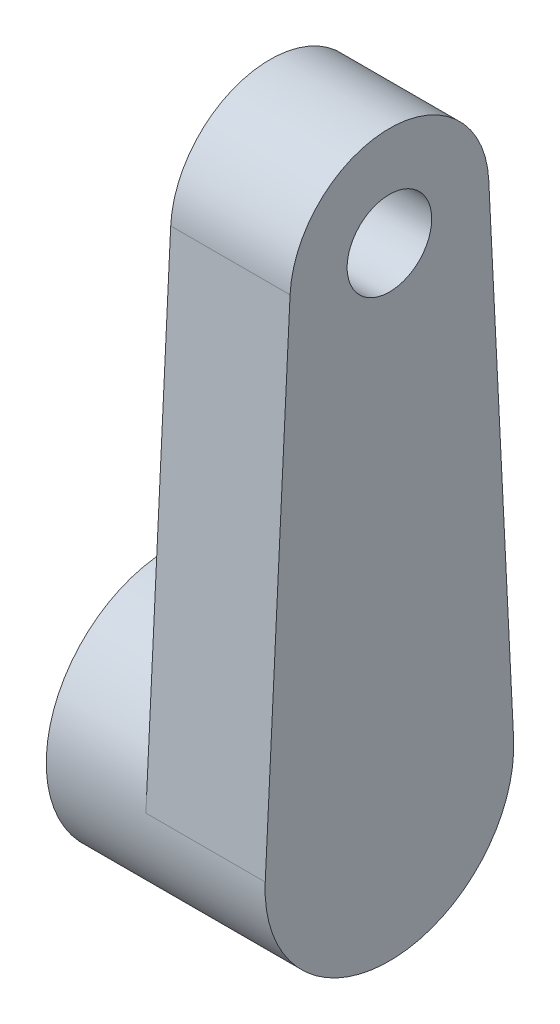
ISO-10303-21;
HEADER;
FILE_DESCRIPTION(('STEP AP214'),'2;1');
FILE_NAME('part.step','',(''),(''),'','','');
FILE_SCHEMA(('AUTOMOTIVE_DESIGN { 1 0 10303 214 1 1 1 1 }'));
ENDSEC;
DATA;
#1=APPLICATION_CONTEXT('core data for automotive mechanical design processes');
#2=APPLICATION_PROTOCOL_DEFINITION('international standard','automotive_design',2000,#1);
#3=PRODUCT_CONTEXT('',#1,'mechanical');
#4=PRODUCT('Part','Part','',(#3));
#5=PRODUCT_RELATED_PRODUCT_CATEGORY('part','',(#4));
#6=PRODUCT_DEFINITION_FORMATION('','',#4);
#7=PRODUCT_DEFINITION_CONTEXT('part definition',#1,'design');
#8=PRODUCT_DEFINITION('design','',#6,#7);
#9=PRODUCT_DEFINITION_SHAPE('','',#8);
#10=(LENGTH_UNIT() NAMED_UNIT(*) SI_UNIT(.MILLI.,.METRE.));
#11=(NAMED_UNIT(*) PLANE_ANGLE_UNIT() SI_UNIT($,.RADIAN.));
#12=(NAMED_UNIT(*) SI_UNIT($,.STERADIAN.) SOLID_ANGLE_UNIT());
#13=UNCERTAINTY_MEASURE_WITH_UNIT(LENGTH_MEASURE(1.E-05),#10,'distance_accuracy_value','');
#14=(GEOMETRIC_REPRESENTATION_CONTEXT(3) GLOBAL_UNCERTAINTY_ASSIGNED_CONTEXT((#13)) GLOBAL_UNIT_ASSIGNED_CONTEXT((#10,
#11,#12)) REPRESENTATION_CONTEXT('',''));
#15=CARTESIAN_POINT('',(0.,0.,0.));
#16=DIRECTION('',(0.,0.,1.));
#17=DIRECTION('',(1.,0.,0.));
#18=AXIS2_PLACEMENT_3D('',#15,#16,#17);
#19=CARTESIAN_POINT('',(10.,-2.5,1.6583123951777));
#20=DIRECTION('',(0.,1.,0.));
#21=DIRECTION('',(0.,0.,1.));
#22=AXIS2_PLACEMENT_3D('',#19,#20,#21);
#23=PLANE('',#22);
#24=CARTESIAN_POINT('',(5.,-2.5,0.));
#25=DIRECTION('',(0.,1.,0.));
#26=DIRECTION('',(0.,0.,1.));
#27=AXIS2_PLACEMENT_3D('',#24,#25,#26);
#28=CIRCLE('',#27,2.25);
#29=CARTESIAN_POINT('',(6.52069063257456,-2.5,1.6583123951777));
#30=VERTEX_POINT('',#29);
#31=CARTESIAN_POINT('',(6.52069063257456,-2.5,-1.6583123951777));
#32=VERTEX_POINT('',#31);
#33=EDGE_CURVE('E11',#30,#32,#28,.T.);
#34=ORIENTED_EDGE('',*,*,#33,.F.);
#35=DIRECTION('',(-1.,0.,0.));
#36=VECTOR('',#35,1.);
#37=CARTESIAN_POINT('',(10.,-2.5,1.6583123951777));
#38=LINE('',#37,#36);
#39=CARTESIAN_POINT('',(10.,-2.5,1.6583123951777));
#40=VERTEX_POINT('',#39);
#41=EDGE_CURVE('E117',#40,#30,#38,.T.);
#42=ORIENTED_EDGE('',*,*,#41,.F.);
#43=DIRECTION('',(0.,0.,-1.));
#44=VECTOR('',#43,1.);
#45=CARTESIAN_POINT('',(10.,-2.5,1.6583123951777));
#46=LINE('',#45,#44);
#47=CARTESIAN_POINT('',(10.,-2.5,-1.6583123951777));
#48=VERTEX_POINT('',#47);
#49=EDGE_CURVE('E147',#40,#48,#46,.T.);
#50=ORIENTED_EDGE('',*,*,#49,.T.);
#51=DIRECTION('',(-1.,0.,0.));
#52=VECTOR('',#51,1.);
#53=CARTESIAN_POINT('',(10.,-2.5,-1.6583123951777));
#54=LINE('',#53,#52);
#55=EDGE_CURVE('E124',#48,#32,#54,.T.);
#56=ORIENTED_EDGE('',*,*,#55,.T.);
#57=EDGE_LOOP('',(#34,#42,#50,#56));
#58=FACE_BOUND('',#57,.T.);
#59=ADVANCED_FACE('F39',(#58),#23,.T.);
#60=CARTESIAN_POINT('',(0.,0.,0.));
#61=DIRECTION('',(1.,0.,0.));
#62=DIRECTION('',(0.,0.,-1.));
#63=AXIS2_PLACEMENT_3D('',#60,#61,#62);
#64=PLANE('',#63);
#65=CARTESIAN_POINT('',(0.,0.,0.));
#66=DIRECTION('',(1.,0.,0.));
#67=DIRECTION('',(0.,0.,-1.));
#68=AXIS2_PLACEMENT_3D('',#65,#66,#67);
#69=CIRCLE('',#68,12.5);
#70=CARTESIAN_POINT('',(0.,0.,-12.5));
#71=VERTEX_POINT('',#70);
#72=EDGE_CURVE('E126',#71,#71,#69,.T.);
#73=ORIENTED_EDGE('',*,*,#72,.F.);
#74=EDGE_LOOP('',(#73));
#75=FACE_BOUND('',#74,.T.);
#76=CARTESIAN_POINT('',(0.,0.,0.));
#77=DIRECTION('',(1.,0.,0.));
#78=DIRECTION('',(0.,0.,-1.));
#79=AXIS2_PLACEMENT_3D('',#76,#77,#78);
#80=CIRCLE('',#79,3.);
#81=CARTESIAN_POINT('',(0.,-2.5,-1.6583123951777));
#82=VERTEX_POINT('',#81);
#83=CARTESIAN_POINT('',(0.,-2.5,1.6583123951777));
#84=VERTEX_POINT('',#83);
#85=EDGE_CURVE('E139',#82,#84,#80,.T.);
#86=ORIENTED_EDGE('',*,*,#85,.T.);
#87=DIRECTION('',(0.,0.,-1.));
#88=VECTOR('',#87,1.);
#89=CARTESIAN_POINT('',(0.,-2.5,1.6583123951777));
#90=LINE('',#89,#88);
#91=EDGE_CURVE('E122',#84,#82,#90,.T.);
#92=ORIENTED_EDGE('',*,*,#91,.T.);
#93=EDGE_LOOP('',(#86,#92));
#94=FACE_BOUND('',#93,.T.);
#95=ADVANCED_FACE('F136',(#75,#94),#64,.F.);
#96=CARTESIAN_POINT('',(10.,0.,0.));
#97=DIRECTION('',(-1.,0.,0.));
#98=DIRECTION('',(0.,0.,1.));
#99=AXIS2_PLACEMENT_3D('',#96,#97,#98);
#100=CYLINDRICAL_SURFACE('',#99,12.5);
#101=CARTESIAN_POINT('',(2.75,-12.5,0.));
#102=CARTESIAN_POINT('',(2.75000488102638,-12.4999977674912,0.1252986819868));
#103=CARTESIAN_POINT('',(2.76050187231078,-12.4980965123329,0.250661938458594));
#104=CARTESIAN_POINT('',(2.80218903515507,-12.4906952154093,0.497861978665406));
#105=CARTESIAN_POINT('',(2.83339725500035,-12.4851920348931,0.619695589851931));
#106=CARTESIAN_POINT('',(2.91552541844857,-12.4712031058359,0.856224998081114));
#107=CARTESIAN_POINT('',(2.96642818212382,-12.4627199573701,0.97092691529625));
#108=CARTESIAN_POINT('',(3.08645309823584,-12.4436998211695,1.19015008759339));
#109=CARTESIAN_POINT('',(3.15557355048877,-12.4331630251171,1.29467229146123));
#110=CARTESIAN_POINT('',(3.31088515623745,-12.4110699839934,1.49173892052012));
#111=CARTESIAN_POINT('',(3.39723883854912,-12.3995046634254,1.58415425002097));
#112=CARTESIAN_POINT('',(3.5842159193064,-12.3767261918013,1.75326760244449));
#113=CARTESIAN_POINT('',(3.6848402939975,-12.3655130649026,1.82996454920806));
#114=CARTESIAN_POINT('',(3.89840531008349,-12.3446205144066,1.96599369496265));
#115=CARTESIAN_POINT('',(4.0114299788695,-12.3349528032239,2.0251959281109));
#116=CARTESIAN_POINT('',(4.24602363137523,-12.3183728941507,2.12372345891961));
#117=CARTESIAN_POINT('',(4.36759193755188,-12.3114604780441,2.16305033075061));
#118=CARTESIAN_POINT('',(4.61444530740335,-12.3012648124572,2.22029926603351));
#119=CARTESIAN_POINT('',(4.73967674798533,-12.2979435578795,2.23844564821782));
#120=CARTESIAN_POINT('',(4.99144749766331,-12.2951915456139,2.25351448396809));
#121=CARTESIAN_POINT('',(5.11798669789394,-12.2957604666492,2.2504386902034));
#122=CARTESIAN_POINT('',(5.36716478544909,-12.3006898852657,2.22333268298987));
#123=CARTESIAN_POINT('',(5.48983233665805,-12.3050044364384,2.19955638565592));
#124=CARTESIAN_POINT('',(5.72940843527644,-12.316866899555,2.13212365102787));
#125=CARTESIAN_POINT('',(5.84631675524478,-12.3244149390804,2.08846642930116));
#126=CARTESIAN_POINT('',(6.07180514312158,-12.3419425352291,1.9822594118006));
#127=CARTESIAN_POINT('',(6.18033533525481,-12.3519353671767,1.91960600582322));
#128=CARTESIAN_POINT('',(6.38543800314245,-12.3732176723876,1.77725850028802));
#129=CARTESIAN_POINT('',(6.48200935628325,-12.3845072671906,1.69756280282899));
#130=CARTESIAN_POINT('',(6.66192113689688,-12.4073118839222,1.52201857930321));
#131=CARTESIAN_POINT('',(6.74504943632727,-12.4188278010628,1.42595261440165));
#132=CARTESIAN_POINT('',(6.89404090334848,-12.4406367648775,1.22112530278979));
#133=CARTESIAN_POINT('',(6.95990392259604,-12.4509298010443,1.11236384701145));
#134=CARTESIAN_POINT('',(7.07252198562909,-12.4691516328429,0.885019768870841));
#135=CARTESIAN_POINT('',(7.1192562084547,-12.4770778497592,0.766426612967721));
#136=CARTESIAN_POINT('',(7.19208219301229,-12.4896527895691,0.522899253039732));
#137=CARTESIAN_POINT('',(7.21817597312886,-12.4943018329256,0.397965670303355));
#138=CARTESIAN_POINT('',(7.24868797990313,-12.4997549324063,0.14713010849435));
#139=CARTESIAN_POINT('',(7.25339706021023,-12.5006105787524,0.0212645934313453));
#140=CARTESIAN_POINT('',(7.24178440397202,-12.4985225341363,-0.22945586170452));
#141=CARTESIAN_POINT('',(7.22546361660073,-12.4955790146477,-0.354310847131263));
#142=CARTESIAN_POINT('',(7.1724963833318,-12.4862554255897,-0.598552524626933));
#143=CARTESIAN_POINT('',(7.13599592657885,-12.4799000484474,-0.717971900974116));
#144=CARTESIAN_POINT('',(7.04386257152955,-12.4644623821362,-0.94899628592325));
#145=CARTESIAN_POINT('',(6.98822845527442,-12.4553799193784,-1.06060079652314));
#146=CARTESIAN_POINT('',(6.85875495092402,-12.4353669796939,-1.27407696942466));
#147=CARTESIAN_POINT('',(6.78473635943589,-12.4244186663665,-1.37583823911224));
#148=CARTESIAN_POINT('',(6.62083899882707,-12.4019371582136,-1.56559958610652));
#149=CARTESIAN_POINT('',(6.53095887246642,-12.3904039133971,-1.65359848457812));
#150=CARTESIAN_POINT('',(6.33657750091316,-12.3678828600073,-1.81443228613754));
#151=CARTESIAN_POINT('',(6.23191148877673,-12.3569034068723,-1.88706941512665));
#152=CARTESIAN_POINT('',(6.0116923490729,-12.3368965881738,-2.01373073598652));
#153=CARTESIAN_POINT('',(5.89613960574521,-12.327869153752,-2.0677555844518));
#154=CARTESIAN_POINT('',(5.65794816388005,-12.3128530018575,-2.15537258854331));
#155=CARTESIAN_POINT('',(5.53534479225576,-12.3068503934841,-2.1890582916757));
#156=CARTESIAN_POINT('',(5.28610132098664,-12.2985305984642,-2.235331641839));
#157=CARTESIAN_POINT('',(5.15946163861275,-12.2962130321129,-2.24792146258465));
#158=CARTESIAN_POINT('',(4.90771902629066,-12.2955439189313,-2.251577412795));
#159=CARTESIAN_POINT('',(4.78262066834532,-12.2971349368514,-2.24295524222454));
#160=CARTESIAN_POINT('',(4.53568688920232,-12.3039769205597,-2.20511123815911));
#161=CARTESIAN_POINT('',(4.41385145203601,-12.3092278684327,-2.17588950549706));
#162=CARTESIAN_POINT('',(4.17705210788168,-12.3227747458695,-2.09780295588627));
#163=CARTESIAN_POINT('',(4.06207762288378,-12.331065839386,-2.04896932446152));
#164=CARTESIAN_POINT('',(3.84190338333167,-12.3497626645301,-1.93307843743781));
#165=CARTESIAN_POINT('',(3.73670424432347,-12.3601685291918,-1.86602003528115));
#166=CARTESIAN_POINT('',(3.53750044562189,-12.3821021382439,-1.71448870972004));
#167=CARTESIAN_POINT('',(3.4436705259583,-12.3936433960265,-1.6297879913884));
#168=CARTESIAN_POINT('',(3.27145070047158,-12.4164438377711,-1.44585363976476));
#169=CARTESIAN_POINT('',(3.19306435005577,-12.4277029562598,-1.34661666909393));
#170=CARTESIAN_POINT('',(3.05336059235037,-12.4487784100862,-1.13545412119434));
#171=CARTESIAN_POINT('',(2.99218844411853,-12.4585821554973,-1.02343115620963));
#172=CARTESIAN_POINT('',(2.8896285949844,-12.4755196121995,-0.79056144218973));
#173=CARTESIAN_POINT('',(2.84822188963861,-12.4826558868212,-0.66972329836701));
#174=CARTESIAN_POINT('',(2.79499361202622,-12.4919609434263,-0.457071330933701));
#175=CARTESIAN_POINT('',(2.77814915614255,-12.4949589083512,-0.366517696899425));
#176=CARTESIAN_POINT('',(2.75565068184457,-12.4989792344744,-0.183987628103359));
#177=CARTESIAN_POINT('',(2.74999641569082,-12.5000016394097,-0.0920112248856699));
#178=CARTESIAN_POINT('',(2.75,-12.5,0.));
#179=B_SPLINE_CURVE_WITH_KNOTS('',3,(#101,#102,#103,#104,#105,#106,#107,#108,#109,#110,#111,
#112,#113,#114,#115,#116,#117,#118,#119,#120,#121,#122,#123,#124,#125,#126,#127,#128,#129,#130,
#131,#132,#133,#134,#135,#136,#137,#138,#139,#140,#141,#142,#143,#144,#145,#146,#147,#148,#149,
#150,#151,#152,#153,#154,#155,#156,#157,#158,#159,#160,#161,#162,#163,#164,#165,#166,#167,#168,
#169,#170,#171,#172,#173,#174,#175,#176,#177,#178),.UNSPECIFIED.,.T.,.F.,(4,2,2,2,2,2,2,2,2,2,2,
2,2,2,2,2,2,2,2,2,2,2,2,2,2,2,2,2,2,2,2,2,2,2,2,2,2,2,4),(0.,0.375559617107256,
0.751446936801143,1.12700709938379,1.50253222484552,1.88178230491351,2.26105834167076,
2.64308495155389,3.02508129938031,3.40299419072511,3.78087587186721,4.15418667058528,
4.52751220013435,4.90291173817372,5.27834648947039,5.65922447074255,6.04010572441043,
6.42140045723425,6.80265789945357,7.17871401103892,7.55475315008824,7.92810678591766,
8.30148419208381,8.67865469057391,9.05585747845521,9.43765507111872,9.81943919354226,
10.1994536967028,10.57942904085,10.9538542714616,11.3282776693096,11.7021080267961,
12.075961908163,12.4549808618751,12.8340869713554,13.2163022265238,13.59814923835,
13.8739419673183,14.1497285904471),.UNSPECIFIED.);
#180=CARTESIAN_POINT('',(2.75,-12.5,0.));
#181=VERTEX_POINT('',#180);
#182=EDGE_CURVE('E168',#181,#181,#179,.T.);
#183=ORIENTED_EDGE('',*,*,#182,.T.);
#184=EDGE_LOOP('',(#183));
#185=FACE_BOUND('',#184,.T.);
#186=CARTESIAN_POINT('',(10.,0.,0.));
#187=DIRECTION('',(1.,0.,0.));
#188=DIRECTION('',(0.,0.,-1.));
#189=AXIS2_PLACEMENT_3D('',#186,#187,#188);
#190=CIRCLE('',#189,12.5);
#191=CARTESIAN_POINT('',(10.,0.625000000000004,-12.4843652221489));
#192=VERTEX_POINT('',#191);
#193=CARTESIAN_POINT('',(10.,0.625000000000001,12.4843652221489));
#194=VERTEX_POINT('',#193);
#195=EDGE_CURVE('E62',#192,#194,#190,.T.);
#196=ORIENTED_EDGE('',*,*,#195,.F.);
#197=DIRECTION('',(-1.,0.,0.));
#198=VECTOR('',#197,1.);
#199=CARTESIAN_POINT('',(22.,0.625000000000004,-12.4843652221489));
#200=LINE('',#199,#198);
#201=CARTESIAN_POINT('',(22.,0.625000000000004,-12.4843652221489));
#202=VERTEX_POINT('',#201);
#203=EDGE_CURVE('E153',#202,#192,#200,.T.);
#204=ORIENTED_EDGE('',*,*,#203,.F.);
#205=CARTESIAN_POINT('',(22.,0.,0.));
#206=DIRECTION('',(1.,0.,0.));
#207=DIRECTION('',(0.,0.,-1.));
#208=AXIS2_PLACEMENT_3D('',#205,#206,#207);
#209=CIRCLE('',#208,12.5);
#210=CARTESIAN_POINT('',(22.,0.625000000000001,12.4843652221489));
#211=VERTEX_POINT('',#210);
#212=EDGE_CURVE('E170',#211,#202,#209,.T.);
#213=ORIENTED_EDGE('',*,*,#212,.F.);
#214=DIRECTION('',(-1.,0.,0.));
#215=VECTOR('',#214,1.);
#216=CARTESIAN_POINT('',(22.,0.625000000000001,12.4843652221489));
#217=LINE('',#216,#215);
#218=EDGE_CURVE('E144',#211,#194,#217,.T.);
#219=ORIENTED_EDGE('',*,*,#218,.T.);
#220=EDGE_LOOP('',(#196,#204,#213,#219));
#221=FACE_BOUND('',#220,.T.);
#222=ORIENTED_EDGE('',*,*,#72,.T.);
#223=EDGE_LOOP('',(#222));
#224=FACE_BOUND('',#223,.T.);
#225=ADVANCED_FACE('F41',(#185,#221,#224),#100,.T.);
#226=CARTESIAN_POINT('',(10.,0.,0.));
#227=DIRECTION('',(-1.,0.,0.));
#228=DIRECTION('',(0.,0.,1.));
#229=AXIS2_PLACEMENT_3D('',#226,#227,#228);
#230=CYLINDRICAL_SURFACE('',#229,3.);
#231=CARTESIAN_POINT('',(6.52069063257456,-2.5,-1.6583123951777));
#232=CARTESIAN_POINT('',(6.47509421337678,-2.47228406944938,-1.70010898511985));
#233=CARTESIAN_POINT('',(6.42786867038132,-2.44432554077974,-1.73996971077242));
#234=CARTESIAN_POINT('',(6.33017128950012,-2.38856017671114,-1.81576025909372));
#235=CARTESIAN_POINT('',(6.27969567952008,-2.36075355974142,-1.85168537852014));
#236=CARTESIAN_POINT('',(6.17494256920732,-2.30564213036712,-1.91988612652165));
#237=CARTESIAN_POINT('',(6.12062421353852,-2.27834852163473,-1.95210831188629));
#238=CARTESIAN_POINT('',(6.00884909327369,-2.22550056234887,-2.01214993363687));
#239=CARTESIAN_POINT('',(5.95139405139958,-2.19994527406219,-2.03997175469836));
#240=CARTESIAN_POINT('',(5.80555022530763,-2.14012438723561,-2.10298158930754));
#241=CARTESIAN_POINT('',(5.71531590562093,-2.10741110449734,-2.13548464805366));
#242=CARTESIAN_POINT('',(5.52902039102529,-2.05172006322609,-2.18905321449714));
#243=CARTESIAN_POINT('',(5.43299091796051,-2.02869398165208,-2.21017564454843));
#244=CARTESIAN_POINT('',(5.25125935448335,-1.99846228696182,-2.23752267865274));
#245=CARTESIAN_POINT('',(5.16613727020686,-1.98941711086745,-2.24549189266635));
#246=CARTESIAN_POINT('',(4.99506855122998,-1.98248259978637,-2.25161970103235));
#247=CARTESIAN_POINT('',(4.90912205346454,-1.98459144308357,-2.24977989742972));
#248=CARTESIAN_POINT('',(4.73927278582789,-1.99958052452513,-2.23646283020671));
#249=CARTESIAN_POINT('',(4.65536428154269,-2.01242573257562,-2.2250169084675));
#250=CARTESIAN_POINT('',(4.49106351127168,-2.04695666032776,-2.19328758067084));
#251=CARTESIAN_POINT('',(4.41067776554029,-2.06865806505446,-2.1729884905458));
#252=CARTESIAN_POINT('',(4.21518744483067,-2.13096500124009,-2.11227166409882));
#253=CARTESIAN_POINT('',(4.10293235897155,-2.17559025493224,-2.06686994175552));
#254=CARTESIAN_POINT('',(3.88946681207504,-2.2719327660704,-1.96047893616098));
#255=CARTESIAN_POINT('',(3.78826915544101,-2.32365809224478,-1.89947184941519));
#256=CARTESIAN_POINT('',(3.65537287280703,-2.39678220350865,-1.80460036157281));
#257=CARTESIAN_POINT('',(3.61883922140628,-2.41749169038068,-1.7767952156073));
#258=CARTESIAN_POINT('',(3.54768188254289,-2.4588391702548,-1.71911630817276));
#259=CARTESIAN_POINT('',(3.51305136062493,-2.47947713031607,-1.68925095472639));
#260=CARTESIAN_POINT('',(3.47930936742545,-2.5,-1.6583123951777));
#261=B_SPLINE_CURVE_WITH_KNOTS('',3,(#231,#232,#233,#234,#235,#236,#237,#238,#239,#240,#241,
#242,#243,#244,#245,#246,#247,#248,#249,#250,#251,#252,#253,#254,#255,#256,#257,#258,#259,#260),
.UNSPECIFIED.,.F.,.F.,(4,2,2,2,2,2,2,2,2,2,2,2,2,2,4),(0.,0.203295129404301,0.406830615502135,
0.613008886821346,0.819075038899295,1.12200571809086,1.42340682557661,1.68011693394519,
1.93678511675529,2.19261910926667,2.44890818413641,2.83397026581014,3.21947362307265,
3.37050996052318,3.52096271025181),.UNSPECIFIED.);
#262=CARTESIAN_POINT('',(3.47930936742545,-2.5,-1.6583123951777));
#263=VERTEX_POINT('',#262);
#264=EDGE_CURVE('E54',#32,#263,#261,.T.);
#265=ORIENTED_EDGE('',*,*,#264,.F.);
#266=ORIENTED_EDGE('',*,*,#55,.F.);
#267=CARTESIAN_POINT('',(10.,0.,0.));
#268=DIRECTION('',(1.,0.,0.));
#269=DIRECTION('',(0.,0.,-1.));
#270=AXIS2_PLACEMENT_3D('',#267,#268,#269);
#271=CIRCLE('',#270,3.);
#272=EDGE_CURVE('E142',#48,#40,#271,.T.);
#273=ORIENTED_EDGE('',*,*,#272,.T.);
#274=ORIENTED_EDGE('',*,*,#41,.T.);
#275=CARTESIAN_POINT('',(3.47930936742545,-2.5,1.6583123951777));
#276=CARTESIAN_POINT('',(3.52490578662322,-2.47228406944938,1.70010898511985));
#277=CARTESIAN_POINT('',(3.57213132961869,-2.44432554077974,1.73996971077242));
#278=CARTESIAN_POINT('',(3.66982871049988,-2.38856017671114,1.81576025909372));
#279=CARTESIAN_POINT('',(3.72030432047992,-2.36075355974142,1.85168537852014));
#280=CARTESIAN_POINT('',(3.82505743079268,-2.30564213036712,1.91988612652165));
#281=CARTESIAN_POINT('',(3.87937578646149,-2.27834852163473,1.95210831188629));
#282=CARTESIAN_POINT('',(3.99115090672631,-2.22550056234887,2.01214993363687));
#283=CARTESIAN_POINT('',(4.04860594860042,-2.19994527406219,2.03997175469836));
#284=CARTESIAN_POINT('',(4.19444977469238,-2.14012438723561,2.10298158930753));
#285=CARTESIAN_POINT('',(4.28468409437907,-2.10741110449734,2.13548464805366));
#286=CARTESIAN_POINT('',(4.47097960897471,-2.05172006322609,2.18905321449714));
#287=CARTESIAN_POINT('',(4.5670090820395,-2.02869398165208,2.21017564454843));
#288=CARTESIAN_POINT('',(4.74874064551665,-1.99846228696182,2.23752267865274));
#289=CARTESIAN_POINT('',(4.83386272979314,-1.98941711086745,2.24549189266635));
#290=CARTESIAN_POINT('',(5.00493144877002,-1.98248259978637,2.25161970103235));
#291=CARTESIAN_POINT('',(5.09087794653546,-1.98459144308357,2.24977989742972));
#292=CARTESIAN_POINT('',(5.26072721417211,-1.99958052452513,2.23646283020671));
#293=CARTESIAN_POINT('',(5.34463571845732,-2.01242573257562,2.2250169084675));
#294=CARTESIAN_POINT('',(5.50893648872833,-2.04695666032776,2.19328758067084));
#295=CARTESIAN_POINT('',(5.58932223445971,-2.06865806505446,2.1729884905458));
#296=CARTESIAN_POINT('',(5.78481255516933,-2.13096500124009,2.11227166409882));
#297=CARTESIAN_POINT('',(5.89706764102845,-2.17559025493224,2.06686994175552));
#298=CARTESIAN_POINT('',(6.11053318792496,-2.2719327660704,1.96047893616098));
#299=CARTESIAN_POINT('',(6.211730844559,-2.32365809224478,1.89947184941519));
#300=CARTESIAN_POINT('',(6.34462712719297,-2.39678220350865,1.80460036157281));
#301=CARTESIAN_POINT('',(6.38116077859372,-2.41749169038068,1.7767952156073));
#302=CARTESIAN_POINT('',(6.45231811745712,-2.4588391702548,1.71911630817276));
#303=CARTESIAN_POINT('',(6.48694863937507,-2.47947713031607,1.68925095472639));
#304=CARTESIAN_POINT('',(6.52069063257456,-2.5,1.6583123951777));
#305=B_SPLINE_CURVE_WITH_KNOTS('',3,(#275,#276,#277,#278,#279,#280,#281,#282,#283,#284,#285,
#286,#287,#288,#289,#290,#291,#292,#293,#294,#295,#296,#297,#298,#299,#300,#301,#302,#303,#304),
.UNSPECIFIED.,.F.,.F.,(4,2,2,2,2,2,2,2,2,2,2,2,2,2,4),(0.,0.2032951294043,0.406830615502134,
0.613008886821345,0.819075038899295,1.12200571809086,1.42340682557661,1.68011693394518,
1.93678511675529,2.19261910926667,2.44890818413641,2.83397026581014,3.21947362307264,
3.37050996052318,3.52096271025181),.UNSPECIFIED.);
#306=CARTESIAN_POINT('',(3.47930936742545,-2.5,1.6583123951777));
#307=VERTEX_POINT('',#306);
#308=EDGE_CURVE('E104',#307,#30,#305,.T.);
#309=ORIENTED_EDGE('',*,*,#308,.F.);
#310=EDGE_CURVE('E113',#307,#84,#38,.T.);
#311=ORIENTED_EDGE('',*,*,#310,.T.);
#312=ORIENTED_EDGE('',*,*,#85,.F.);
#313=EDGE_CURVE('E128',#263,#82,#54,.T.);
#314=ORIENTED_EDGE('',*,*,#313,.F.);
#315=EDGE_LOOP('',(#265,#266,#273,#274,#309,#311,#312,#314));
#316=FACE_BOUND('',#315,.T.);
#317=ADVANCED_FACE('F111',(#316),#230,.F.);
#318=EDGE_CURVE('E44',#263,#307,#28,.T.);
#319=ORIENTED_EDGE('',*,*,#318,.F.);
#320=ORIENTED_EDGE('',*,*,#313,.T.);
#321=ORIENTED_EDGE('',*,*,#91,.F.);
#322=ORIENTED_EDGE('',*,*,#310,.F.);
#323=EDGE_LOOP('',(#319,#320,#321,#322));
#324=FACE_BOUND('',#323,.T.);
#325=ADVANCED_FACE('F120',(#324),#23,.T.);
#326=CARTESIAN_POINT('',(10.,50.,0.));
#327=DIRECTION('',(1.,0.,0.));
#328=DIRECTION('',(0.,0.,-1.));
#329=AXIS2_PLACEMENT_3D('',#326,#327,#328);
#330=PLANE('',#329);
#331=ORIENTED_EDGE('',*,*,#49,.F.);
#332=ORIENTED_EDGE('',*,*,#272,.F.);
#333=EDGE_LOOP('',(#331,#332));
#334=FACE_BOUND('',#333,.T.);
#335=ADVANCED_FACE('F208',(#334),#330,.F.);
#336=CARTESIAN_POINT('',(10.,50.,0.));
#337=DIRECTION('',(1.,0.,0.));
#338=DIRECTION('',(0.,0.,-1.));
#339=AXIS2_PLACEMENT_3D('',#336,#337,#338);
#340=CIRCLE('',#339,4.25);
#341=CARTESIAN_POINT('',(10.,50.,-4.25));
#342=VERTEX_POINT('',#341);
#343=EDGE_CURVE('E118',#342,#342,#340,.T.);
#344=ORIENTED_EDGE('',*,*,#343,.T.);
#345=EDGE_LOOP('',(#344));
#346=FACE_BOUND('',#345,.T.);
#347=DIRECTION('',(0.,0.998749217771909,0.05));
#348=VECTOR('',#347,1.);
#349=CARTESIAN_POINT('',(10.,50.5,-9.98749217771909));
#350=LINE('',#349,#348);
#351=CARTESIAN_POINT('',(10.,50.5,-9.98749217771909));
#352=VERTEX_POINT('',#351);
#353=EDGE_CURVE('E160',#192,#352,#350,.T.);
#354=ORIENTED_EDGE('',*,*,#353,.F.);
#355=ORIENTED_EDGE('',*,*,#195,.T.);
#356=DIRECTION('',(0.,-0.998749217771909,0.0500000000000001));
#357=VECTOR('',#356,1.);
#358=CARTESIAN_POINT('',(10.,50.5,9.98749217771909));
#359=LINE('',#358,#357);
#360=CARTESIAN_POINT('',(10.,50.5,9.98749217771909));
#361=VERTEX_POINT('',#360);
#362=EDGE_CURVE('E163',#361,#194,#359,.T.);
#363=ORIENTED_EDGE('',*,*,#362,.F.);
#364=CARTESIAN_POINT('',(10.,50.,0.));
#365=DIRECTION('',(1.,0.,0.));
#366=DIRECTION('',(0.,0.,-1.));
#367=AXIS2_PLACEMENT_3D('',#364,#365,#366);
#368=CIRCLE('',#367,10.);
#369=EDGE_CURVE('E165',#352,#361,#368,.T.);
#370=ORIENTED_EDGE('',*,*,#369,.F.);
#371=EDGE_LOOP('',(#354,#355,#363,#370));
#372=FACE_BOUND('',#371,.T.);
#373=ADVANCED_FACE('F213',(#346,#372),#330,.F.);
#374=CARTESIAN_POINT('',(22.,50.,0.));
#375=DIRECTION('',(-1.,0.,0.));
#376=DIRECTION('',(0.,0.,1.));
#377=AXIS2_PLACEMENT_3D('',#374,#375,#376);
#378=CYLINDRICAL_SURFACE('',#377,10.);
#379=ORIENTED_EDGE('',*,*,#369,.T.);
#380=DIRECTION('',(-1.,0.,0.));
#381=VECTOR('',#380,1.);
#382=CARTESIAN_POINT('',(22.,50.5,9.98749217771909));
#383=LINE('',#382,#381);
#384=CARTESIAN_POINT('',(22.,50.5,9.98749217771909));
#385=VERTEX_POINT('',#384);
#386=EDGE_CURVE('E140',#385,#361,#383,.T.);
#387=ORIENTED_EDGE('',*,*,#386,.F.);
#388=CARTESIAN_POINT('',(22.,50.,0.));
#389=DIRECTION('',(1.,0.,0.));
#390=DIRECTION('',(0.,0.,-1.));
#391=AXIS2_PLACEMENT_3D('',#388,#389,#390);
#392=CIRCLE('',#391,10.);
#393=CARTESIAN_POINT('',(22.,50.5,-9.98749217771909));
#394=VERTEX_POINT('',#393);
#395=EDGE_CURVE('E162',#394,#385,#392,.T.);
#396=ORIENTED_EDGE('',*,*,#395,.F.);
#397=DIRECTION('',(-1.,0.,0.));
#398=VECTOR('',#397,1.);
#399=CARTESIAN_POINT('',(22.,50.5,-9.98749217771909));
#400=LINE('',#399,#398);
#401=EDGE_CURVE('E156',#394,#352,#400,.T.);
#402=ORIENTED_EDGE('',*,*,#401,.T.);
#403=EDGE_LOOP('',(#379,#387,#396,#402));
#404=FACE_BOUND('',#403,.T.);
#405=ADVANCED_FACE('F209',(#404),#378,.T.);
#406=CARTESIAN_POINT('',(22.,50.5,9.98749217771909));
#407=DIRECTION('',(0.,-0.0500000000000001,-0.998749217771909));
#408=DIRECTION('',(0.,0.998749217771909,-0.0500000000000001));
#409=AXIS2_PLACEMENT_3D('',#406,#407,#408);
#410=PLANE('',#409);
#411=ORIENTED_EDGE('',*,*,#362,.T.);
#412=ORIENTED_EDGE('',*,*,#218,.F.);
#413=DIRECTION('',(0.,-0.998749217771909,0.0500000000000001));
#414=VECTOR('',#413,1.);
#415=CARTESIAN_POINT('',(22.,50.5,9.98749217771909));
#416=LINE('',#415,#414);
#417=EDGE_CURVE('E172',#385,#211,#416,.T.);
#418=ORIENTED_EDGE('',*,*,#417,.F.);
#419=ORIENTED_EDGE('',*,*,#386,.T.);
#420=EDGE_LOOP('',(#411,#412,#418,#419));
#421=FACE_BOUND('',#420,.T.);
#422=ADVANCED_FACE('F212',(#421),#410,.F.);
#423=CARTESIAN_POINT('',(22.,50.5,-9.98749217771909));
#424=DIRECTION('',(0.,-0.05,0.998749217771909));
#425=DIRECTION('',(0.,-0.998749217771909,-0.05));
#426=AXIS2_PLACEMENT_3D('',#423,#424,#425);
#427=PLANE('',#426);
#428=ORIENTED_EDGE('',*,*,#353,.T.);
#429=ORIENTED_EDGE('',*,*,#401,.F.);
#430=DIRECTION('',(0.,0.998749217771909,0.05));
#431=VECTOR('',#430,1.);
#432=CARTESIAN_POINT('',(22.,50.5,-9.98749217771909));
#433=LINE('',#432,#431);
#434=EDGE_CURVE('E159',#202,#394,#433,.T.);
#435=ORIENTED_EDGE('',*,*,#434,.F.);
#436=ORIENTED_EDGE('',*,*,#203,.T.);
#437=EDGE_LOOP('',(#428,#429,#435,#436));
#438=FACE_BOUND('',#437,.T.);
#439=ADVANCED_FACE('F217',(#438),#427,.F.);
#440=CARTESIAN_POINT('',(22.,50.,0.));
#441=DIRECTION('',(1.,0.,0.));
#442=DIRECTION('',(0.,0.,-1.));
#443=AXIS2_PLACEMENT_3D('',#440,#441,#442);
#444=PLANE('',#443);
#445=CARTESIAN_POINT('',(22.,50.,0.));
#446=DIRECTION('',(1.,0.,0.));
#447=DIRECTION('',(0.,0.,-1.));
#448=AXIS2_PLACEMENT_3D('',#445,#446,#447);
#449=CIRCLE('',#448,4.25);
#450=CARTESIAN_POINT('',(22.,50.,-4.25));
#451=VERTEX_POINT('',#450);
#452=EDGE_CURVE('E283',#451,#451,#449,.T.);
#453=ORIENTED_EDGE('',*,*,#452,.F.);
#454=EDGE_LOOP('',(#453));
#455=FACE_BOUND('',#454,.T.);
#456=ORIENTED_EDGE('',*,*,#395,.T.);
#457=ORIENTED_EDGE('',*,*,#417,.T.);
#458=ORIENTED_EDGE('',*,*,#212,.T.);
#459=ORIENTED_EDGE('',*,*,#434,.T.);
#460=EDGE_LOOP('',(#456,#457,#458,#459));
#461=FACE_BOUND('',#460,.T.);
#462=ADVANCED_FACE('F192',(#455,#461),#444,.T.);
#463=CARTESIAN_POINT('',(5.,-12.5,0.));
#464=DIRECTION('',(0.,1.,0.));
#465=DIRECTION('',(0.,0.,1.));
#466=AXIS2_PLACEMENT_3D('',#463,#464,#465);
#467=CYLINDRICAL_SURFACE('',#466,2.25);
#468=ORIENTED_EDGE('',*,*,#33,.T.);
#469=ORIENTED_EDGE('',*,*,#264,.T.);
#470=ORIENTED_EDGE('',*,*,#318,.T.);
#471=ORIENTED_EDGE('',*,*,#308,.T.);
#472=EDGE_LOOP('',(#468,#469,#470,#471));
#473=FACE_BOUND('',#472,.T.);
#474=ORIENTED_EDGE('',*,*,#182,.F.);
#475=EDGE_LOOP('',(#474));
#476=FACE_BOUND('',#475,.T.);
#477=ADVANCED_FACE('F102',(#473,#476),#467,.F.);
#478=CARTESIAN_POINT('',(0.,50.,0.));
#479=DIRECTION('',(1.,0.,0.));
#480=DIRECTION('',(0.,0.,-1.));
#481=AXIS2_PLACEMENT_3D('',#478,#479,#480);
#482=CYLINDRICAL_SURFACE('',#481,4.25);
#483=ORIENTED_EDGE('',*,*,#452,.T.);
#484=EDGE_LOOP('',(#483));
#485=FACE_BOUND('',#484,.T.);
#486=ORIENTED_EDGE('',*,*,#343,.F.);
#487=EDGE_LOOP('',(#486));
#488=FACE_BOUND('',#487,.T.);
#489=ADVANCED_FACE('F191',(#485,#488),#482,.F.);
#490=CLOSED_SHELL('',(#59,#95,#225,#317,#325,#335,#373,#405,#422,#439,#462,#477,#489));
#491=MANIFOLD_SOLID_BREP('B2',#490);
#492=ADVANCED_BREP_SHAPE_REPRESENTATION('',(#18,#491),#14);
#493=SHAPE_DEFINITION_REPRESENTATION(#9,#492);
ENDSEC;
END-ISO-10303-21;
